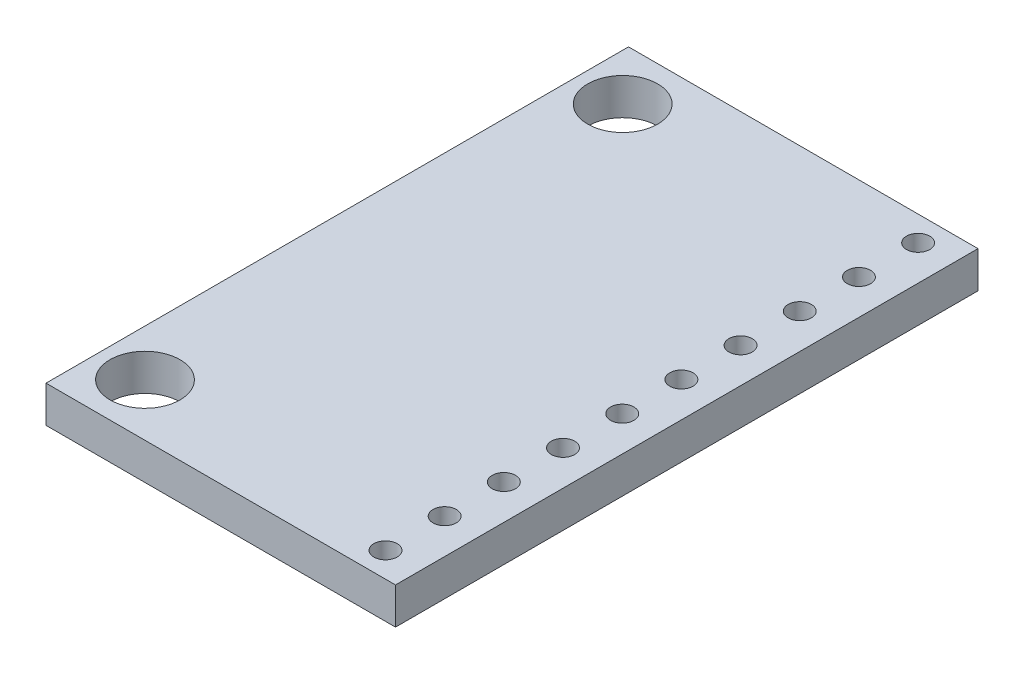
ISO-10303-21;
HEADER;
FILE_DESCRIPTION(('STEP AP214'),'2;1');
FILE_NAME('part.step','',(''),(''),'','','');
FILE_SCHEMA(('AUTOMOTIVE_DESIGN { 1 0 10303 214 1 1 1 1 }'));
ENDSEC;
DATA;
#1=APPLICATION_CONTEXT('core data for automotive mechanical design processes');
#2=APPLICATION_PROTOCOL_DEFINITION('international standard','automotive_design',2000,#1);
#3=PRODUCT_CONTEXT('',#1,'mechanical');
#4=PRODUCT('Part','Part','',(#3));
#5=PRODUCT_RELATED_PRODUCT_CATEGORY('part','',(#4));
#6=PRODUCT_DEFINITION_FORMATION('','',#4);
#7=PRODUCT_DEFINITION_CONTEXT('part definition',#1,'design');
#8=PRODUCT_DEFINITION('design','',#6,#7);
#9=PRODUCT_DEFINITION_SHAPE('','',#8);
#10=(LENGTH_UNIT() NAMED_UNIT(*) SI_UNIT(.MILLI.,.METRE.));
#11=(NAMED_UNIT(*) PLANE_ANGLE_UNIT() SI_UNIT($,.RADIAN.));
#12=(NAMED_UNIT(*) SI_UNIT($,.STERADIAN.) SOLID_ANGLE_UNIT());
#13=UNCERTAINTY_MEASURE_WITH_UNIT(LENGTH_MEASURE(1.E-05),#10,'distance_accuracy_value','');
#14=(GEOMETRIC_REPRESENTATION_CONTEXT(3) GLOBAL_UNCERTAINTY_ASSIGNED_CONTEXT((#13)) GLOBAL_UNIT_ASSIGNED_CONTEXT((#10,
#11,#12)) REPRESENTATION_CONTEXT('',''));
#15=CARTESIAN_POINT('',(0.,0.,0.));
#16=DIRECTION('',(0.,0.,1.));
#17=DIRECTION('',(1.,0.,0.));
#18=AXIS2_PLACEMENT_3D('',#15,#16,#17);
#19=CARTESIAN_POINT('',(0.,0.,0.));
#20=DIRECTION('',(0.,1.,0.));
#21=DIRECTION('',(0.,0.,1.));
#22=AXIS2_PLACEMENT_3D('',#19,#20,#21);
#23=PLANE('',#22);
#24=CARTESIAN_POINT('',(6.,0.,11.43));
#25=DIRECTION('',(0.,1.,0.));
#26=DIRECTION('',(0.,0.,1.));
#27=AXIS2_PLACEMENT_3D('',#24,#25,#26);
#28=CIRCLE('',#27,0.5);
#29=CARTESIAN_POINT('',(6.,0.,11.93));
#30=VERTEX_POINT('',#29);
#31=EDGE_CURVE('E115',#30,#30,#28,.T.);
#32=ORIENTED_EDGE('',*,*,#31,.T.);
#33=EDGE_LOOP('',(#32));
#34=FACE_BOUND('',#33,.T.);
#35=CARTESIAN_POINT('',(6.,0.,8.89));
#36=DIRECTION('',(0.,1.,0.));
#37=DIRECTION('',(0.,0.,1.));
#38=AXIS2_PLACEMENT_3D('',#35,#36,#37);
#39=CIRCLE('',#38,0.5);
#40=CARTESIAN_POINT('',(6.,0.,9.39));
#41=VERTEX_POINT('',#40);
#42=EDGE_CURVE('E119',#41,#41,#39,.T.);
#43=ORIENTED_EDGE('',*,*,#42,.T.);
#44=EDGE_LOOP('',(#43));
#45=FACE_BOUND('',#44,.T.);
#46=CARTESIAN_POINT('',(6.,0.,6.35));
#47=DIRECTION('',(0.,1.,0.));
#48=DIRECTION('',(0.,0.,1.));
#49=AXIS2_PLACEMENT_3D('',#46,#47,#48);
#50=CIRCLE('',#49,0.5);
#51=CARTESIAN_POINT('',(6.,0.,6.85));
#52=VERTEX_POINT('',#51);
#53=EDGE_CURVE('E122',#52,#52,#50,.T.);
#54=ORIENTED_EDGE('',*,*,#53,.T.);
#55=EDGE_LOOP('',(#54));
#56=FACE_BOUND('',#55,.T.);
#57=CARTESIAN_POINT('',(6.,0.,3.81));
#58=DIRECTION('',(0.,1.,0.));
#59=DIRECTION('',(0.,0.,1.));
#60=AXIS2_PLACEMENT_3D('',#57,#58,#59);
#61=CIRCLE('',#60,0.5);
#62=CARTESIAN_POINT('',(6.,0.,4.31));
#63=VERTEX_POINT('',#62);
#64=EDGE_CURVE('E125',#63,#63,#61,.T.);
#65=ORIENTED_EDGE('',*,*,#64,.T.);
#66=EDGE_LOOP('',(#65));
#67=FACE_BOUND('',#66,.T.);
#68=CARTESIAN_POINT('',(6.,0.,1.27));
#69=DIRECTION('',(0.,1.,0.));
#70=DIRECTION('',(0.,0.,1.));
#71=AXIS2_PLACEMENT_3D('',#68,#69,#70);
#72=CIRCLE('',#71,0.5);
#73=CARTESIAN_POINT('',(6.,0.,1.77));
#74=VERTEX_POINT('',#73);
#75=EDGE_CURVE('E128',#74,#74,#72,.T.);
#76=ORIENTED_EDGE('',*,*,#75,.T.);
#77=EDGE_LOOP('',(#76));
#78=FACE_BOUND('',#77,.T.);
#79=CARTESIAN_POINT('',(6.,0.,-1.27));
#80=DIRECTION('',(0.,1.,0.));
#81=DIRECTION('',(0.,0.,1.));
#82=AXIS2_PLACEMENT_3D('',#79,#80,#81);
#83=CIRCLE('',#82,0.5);
#84=CARTESIAN_POINT('',(6.,0.,-0.77));
#85=VERTEX_POINT('',#84);
#86=EDGE_CURVE('E131',#85,#85,#83,.T.);
#87=ORIENTED_EDGE('',*,*,#86,.T.);
#88=EDGE_LOOP('',(#87));
#89=FACE_BOUND('',#88,.T.);
#90=CARTESIAN_POINT('',(6.,0.,-3.81));
#91=DIRECTION('',(0.,1.,0.));
#92=DIRECTION('',(0.,0.,1.));
#93=AXIS2_PLACEMENT_3D('',#90,#91,#92);
#94=CIRCLE('',#93,0.5);
#95=CARTESIAN_POINT('',(6.,0.,-3.31));
#96=VERTEX_POINT('',#95);
#97=EDGE_CURVE('E134',#96,#96,#94,.T.);
#98=ORIENTED_EDGE('',*,*,#97,.T.);
#99=EDGE_LOOP('',(#98));
#100=FACE_BOUND('',#99,.T.);
#101=CARTESIAN_POINT('',(6.,0.,-6.35));
#102=DIRECTION('',(0.,1.,0.));
#103=DIRECTION('',(0.,0.,1.));
#104=AXIS2_PLACEMENT_3D('',#101,#102,#103);
#105=CIRCLE('',#104,0.5);
#106=CARTESIAN_POINT('',(6.,0.,-5.85));
#107=VERTEX_POINT('',#106);
#108=EDGE_CURVE('E137',#107,#107,#105,.T.);
#109=ORIENTED_EDGE('',*,*,#108,.T.);
#110=EDGE_LOOP('',(#109));
#111=FACE_BOUND('',#110,.T.);
#112=CARTESIAN_POINT('',(6.,0.,-8.89));
#113=DIRECTION('',(0.,1.,0.));
#114=DIRECTION('',(0.,0.,1.));
#115=AXIS2_PLACEMENT_3D('',#112,#113,#114);
#116=CIRCLE('',#115,0.5);
#117=CARTESIAN_POINT('',(6.,0.,-8.39));
#118=VERTEX_POINT('',#117);
#119=EDGE_CURVE('E140',#118,#118,#116,.T.);
#120=ORIENTED_EDGE('',*,*,#119,.T.);
#121=EDGE_LOOP('',(#120));
#122=FACE_BOUND('',#121,.T.);
#123=CARTESIAN_POINT('',(6.,0.,-11.43));
#124=DIRECTION('',(0.,1.,0.));
#125=DIRECTION('',(0.,0.,1.));
#126=AXIS2_PLACEMENT_3D('',#123,#124,#125);
#127=CIRCLE('',#126,0.5);
#128=CARTESIAN_POINT('',(6.,0.,-10.93));
#129=VERTEX_POINT('',#128);
#130=EDGE_CURVE('E143',#129,#129,#127,.T.);
#131=ORIENTED_EDGE('',*,*,#130,.T.);
#132=EDGE_LOOP('',(#131));
#133=FACE_BOUND('',#132,.T.);
#134=CARTESIAN_POINT('',(-5.5,0.,10.25));
#135=DIRECTION('',(0.,1.,0.));
#136=DIRECTION('',(0.,0.,1.));
#137=AXIS2_PLACEMENT_3D('',#134,#135,#136);
#138=CIRCLE('',#137,1.5);
#139=CARTESIAN_POINT('',(-5.5,0.,11.75));
#140=VERTEX_POINT('',#139);
#141=EDGE_CURVE('E145',#140,#140,#138,.T.);
#142=ORIENTED_EDGE('',*,*,#141,.T.);
#143=EDGE_LOOP('',(#142));
#144=FACE_BOUND('',#143,.T.);
#145=CARTESIAN_POINT('',(-5.5,0.,-10.25));
#146=DIRECTION('',(0.,1.,0.));
#147=DIRECTION('',(0.,0.,1.));
#148=AXIS2_PLACEMENT_3D('',#145,#146,#147);
#149=CIRCLE('',#148,1.5);
#150=CARTESIAN_POINT('',(-5.5,0.,-8.75));
#151=VERTEX_POINT('',#150);
#152=EDGE_CURVE('E20',#151,#151,#149,.T.);
#153=ORIENTED_EDGE('',*,*,#152,.T.);
#154=EDGE_LOOP('',(#153));
#155=FACE_BOUND('',#154,.T.);
#156=DIRECTION('',(0.,0.,-1.));
#157=VECTOR('',#156,1.);
#158=CARTESIAN_POINT('',(7.5,0.,12.5));
#159=LINE('',#158,#157);
#160=CARTESIAN_POINT('',(7.5,0.,12.5));
#161=VERTEX_POINT('',#160);
#162=CARTESIAN_POINT('',(7.5,0.,-12.5));
#163=VERTEX_POINT('',#162);
#164=EDGE_CURVE('E154',#161,#163,#159,.T.);
#165=ORIENTED_EDGE('',*,*,#164,.F.);
#166=DIRECTION('',(1.,0.,0.));
#167=VECTOR('',#166,1.);
#168=CARTESIAN_POINT('',(-7.5,0.,12.5));
#169=LINE('',#168,#167);
#170=CARTESIAN_POINT('',(-7.5,0.,12.5));
#171=VERTEX_POINT('',#170);
#172=EDGE_CURVE('E55',#171,#161,#169,.T.);
#173=ORIENTED_EDGE('',*,*,#172,.F.);
#174=DIRECTION('',(0.,0.,1.));
#175=VECTOR('',#174,1.);
#176=CARTESIAN_POINT('',(-7.5,0.,-12.5));
#177=LINE('',#176,#175);
#178=CARTESIAN_POINT('',(-7.5,0.,-12.5));
#179=VERTEX_POINT('',#178);
#180=EDGE_CURVE('E57',#179,#171,#177,.T.);
#181=ORIENTED_EDGE('',*,*,#180,.F.);
#182=DIRECTION('',(-1.,0.,0.));
#183=VECTOR('',#182,1.);
#184=CARTESIAN_POINT('',(7.5,0.,-12.5));
#185=LINE('',#184,#183);
#186=EDGE_CURVE('E59',#163,#179,#185,.T.);
#187=ORIENTED_EDGE('',*,*,#186,.F.);
#188=EDGE_LOOP('',(#165,#173,#181,#187));
#189=FACE_BOUND('',#188,.T.);
#190=ADVANCED_FACE('F17',(#34,#45,#56,#67,#78,#89,#100,#111,#122,#133,#144,#155,#189),#23,.F.);
#191=CARTESIAN_POINT('',(7.5,0.,-12.5));
#192=DIRECTION('',(0.,0.,-1.));
#193=DIRECTION('',(-1.,0.,0.));
#194=AXIS2_PLACEMENT_3D('',#191,#192,#193);
#195=PLANE('',#194);
#196=DIRECTION('',(1.,0.,0.));
#197=VECTOR('',#196,1.);
#198=CARTESIAN_POINT('',(0.,1.57,-12.5));
#199=LINE('',#198,#197);
#200=CARTESIAN_POINT('',(7.5,1.57,-12.5));
#201=VERTEX_POINT('',#200);
#202=CARTESIAN_POINT('',(-7.5,1.57,-12.5));
#203=VERTEX_POINT('',#202);
#204=EDGE_CURVE('E118',#201,#203,#199,.F.);
#205=ORIENTED_EDGE('',*,*,#204,.F.);
#206=DIRECTION('',(0.,1.,0.));
#207=VECTOR('',#206,1.);
#208=CARTESIAN_POINT('',(7.5,0.,-12.5));
#209=LINE('',#208,#207);
#210=EDGE_CURVE('E70',#163,#201,#209,.T.);
#211=ORIENTED_EDGE('',*,*,#210,.F.);
#212=ORIENTED_EDGE('',*,*,#186,.T.);
#213=DIRECTION('',(0.,1.,0.));
#214=VECTOR('',#213,1.);
#215=CARTESIAN_POINT('',(-7.5,0.,-12.5));
#216=LINE('',#215,#214);
#217=EDGE_CURVE('E64',#203,#179,#216,.F.);
#218=ORIENTED_EDGE('',*,*,#217,.F.);
#219=EDGE_LOOP('',(#205,#211,#212,#218));
#220=FACE_BOUND('',#219,.T.);
#221=ADVANCED_FACE('F67',(#220),#195,.T.);
#222=CARTESIAN_POINT('',(-7.5,0.,-12.5));
#223=DIRECTION('',(-1.,0.,0.));
#224=DIRECTION('',(0.,0.,1.));
#225=AXIS2_PLACEMENT_3D('',#222,#223,#224);
#226=PLANE('',#225);
#227=DIRECTION('',(0.,0.,1.));
#228=VECTOR('',#227,1.);
#229=CARTESIAN_POINT('',(-7.5,1.57,0.));
#230=LINE('',#229,#228);
#231=CARTESIAN_POINT('',(-7.5,1.57,12.5));
#232=VERTEX_POINT('',#231);
#233=EDGE_CURVE('E75',#203,#232,#230,.T.);
#234=ORIENTED_EDGE('',*,*,#233,.F.);
#235=ORIENTED_EDGE('',*,*,#217,.T.);
#236=ORIENTED_EDGE('',*,*,#180,.T.);
#237=DIRECTION('',(0.,1.,0.));
#238=VECTOR('',#237,1.);
#239=CARTESIAN_POINT('',(-7.5,0.,12.5));
#240=LINE('',#239,#238);
#241=EDGE_CURVE('E78',#232,#171,#240,.F.);
#242=ORIENTED_EDGE('',*,*,#241,.F.);
#243=EDGE_LOOP('',(#234,#235,#236,#242));
#244=FACE_BOUND('',#243,.T.);
#245=ADVANCED_FACE('F73',(#244),#226,.T.);
#246=CARTESIAN_POINT('',(-7.5,0.,12.5));
#247=DIRECTION('',(0.,0.,1.));
#248=DIRECTION('',(1.,0.,0.));
#249=AXIS2_PLACEMENT_3D('',#246,#247,#248);
#250=PLANE('',#249);
#251=DIRECTION('',(1.,0.,0.));
#252=VECTOR('',#251,1.);
#253=CARTESIAN_POINT('',(0.,1.57,12.5));
#254=LINE('',#253,#252);
#255=CARTESIAN_POINT('',(7.5,1.57,12.5));
#256=VERTEX_POINT('',#255);
#257=EDGE_CURVE('E161',#232,#256,#254,.T.);
#258=ORIENTED_EDGE('',*,*,#257,.F.);
#259=ORIENTED_EDGE('',*,*,#241,.T.);
#260=ORIENTED_EDGE('',*,*,#172,.T.);
#261=DIRECTION('',(0.,1.,0.));
#262=VECTOR('',#261,1.);
#263=CARTESIAN_POINT('',(7.5,0.,12.5));
#264=LINE('',#263,#262);
#265=EDGE_CURVE('E35',#256,#161,#264,.F.);
#266=ORIENTED_EDGE('',*,*,#265,.F.);
#267=EDGE_LOOP('',(#258,#259,#260,#266));
#268=FACE_BOUND('',#267,.T.);
#269=ADVANCED_FACE('F159',(#268),#250,.T.);
#270=CARTESIAN_POINT('',(7.5,0.,12.5));
#271=DIRECTION('',(1.,0.,0.));
#272=DIRECTION('',(0.,0.,-1.));
#273=AXIS2_PLACEMENT_3D('',#270,#271,#272);
#274=PLANE('',#273);
#275=DIRECTION('',(0.,0.,1.));
#276=VECTOR('',#275,1.);
#277=CARTESIAN_POINT('',(7.5,1.57,0.));
#278=LINE('',#277,#276);
#279=EDGE_CURVE('E114',#256,#201,#278,.F.);
#280=ORIENTED_EDGE('',*,*,#279,.F.);
#281=ORIENTED_EDGE('',*,*,#265,.T.);
#282=ORIENTED_EDGE('',*,*,#164,.T.);
#283=ORIENTED_EDGE('',*,*,#210,.T.);
#284=EDGE_LOOP('',(#280,#281,#282,#283));
#285=FACE_BOUND('',#284,.T.);
#286=ADVANCED_FACE('F167',(#285),#274,.T.);
#287=CARTESIAN_POINT('',(-5.5,0.,-10.25));
#288=DIRECTION('',(0.,1.,0.));
#289=DIRECTION('',(0.,0.,1.));
#290=AXIS2_PLACEMENT_3D('',#287,#288,#289);
#291=CYLINDRICAL_SURFACE('',#290,1.5);
#292=ORIENTED_EDGE('',*,*,#152,.F.);
#293=EDGE_LOOP('',(#292));
#294=FACE_BOUND('',#293,.T.);
#295=CARTESIAN_POINT('',(-5.5,1.57,-10.25));
#296=DIRECTION('',(0.,1.,0.));
#297=DIRECTION('',(0.,0.,1.));
#298=AXIS2_PLACEMENT_3D('',#295,#296,#297);
#299=CIRCLE('',#298,1.5);
#300=CARTESIAN_POINT('',(-5.5,1.57,-8.75));
#301=VERTEX_POINT('',#300);
#302=EDGE_CURVE('E111',#301,#301,#299,.F.);
#303=ORIENTED_EDGE('',*,*,#302,.F.);
#304=EDGE_LOOP('',(#303));
#305=FACE_BOUND('',#304,.T.);
#306=ADVANCED_FACE('F169',(#294,#305),#291,.F.);
#307=CARTESIAN_POINT('',(-5.5,0.,10.25));
#308=DIRECTION('',(0.,1.,0.));
#309=DIRECTION('',(0.,0.,1.));
#310=AXIS2_PLACEMENT_3D('',#307,#308,#309);
#311=CYLINDRICAL_SURFACE('',#310,1.5);
#312=ORIENTED_EDGE('',*,*,#141,.F.);
#313=EDGE_LOOP('',(#312));
#314=FACE_BOUND('',#313,.T.);
#315=CARTESIAN_POINT('',(-5.5,1.57,10.25));
#316=DIRECTION('',(0.,1.,0.));
#317=DIRECTION('',(0.,0.,1.));
#318=AXIS2_PLACEMENT_3D('',#315,#316,#317);
#319=CIRCLE('',#318,1.5);
#320=CARTESIAN_POINT('',(-5.5,1.57,11.75));
#321=VERTEX_POINT('',#320);
#322=EDGE_CURVE('E108',#321,#321,#319,.F.);
#323=ORIENTED_EDGE('',*,*,#322,.F.);
#324=EDGE_LOOP('',(#323));
#325=FACE_BOUND('',#324,.T.);
#326=ADVANCED_FACE('F176',(#314,#325),#311,.F.);
#327=CARTESIAN_POINT('',(6.,0.,-11.43));
#328=DIRECTION('',(0.,1.,0.));
#329=DIRECTION('',(0.,0.,1.));
#330=AXIS2_PLACEMENT_3D('',#327,#328,#329);
#331=CYLINDRICAL_SURFACE('',#330,0.5);
#332=ORIENTED_EDGE('',*,*,#130,.F.);
#333=EDGE_LOOP('',(#332));
#334=FACE_BOUND('',#333,.T.);
#335=CARTESIAN_POINT('',(6.,1.57,-11.43));
#336=DIRECTION('',(0.,1.,0.));
#337=DIRECTION('',(0.,0.,1.));
#338=AXIS2_PLACEMENT_3D('',#335,#336,#337);
#339=CIRCLE('',#338,0.5);
#340=CARTESIAN_POINT('',(6.,1.57,-10.93));
#341=VERTEX_POINT('',#340);
#342=EDGE_CURVE('E105',#341,#341,#339,.F.);
#343=ORIENTED_EDGE('',*,*,#342,.F.);
#344=EDGE_LOOP('',(#343));
#345=FACE_BOUND('',#344,.T.);
#346=ADVANCED_FACE('F222',(#334,#345),#331,.F.);
#347=CARTESIAN_POINT('',(6.,0.,-8.89));
#348=DIRECTION('',(0.,1.,0.));
#349=DIRECTION('',(0.,0.,1.));
#350=AXIS2_PLACEMENT_3D('',#347,#348,#349);
#351=CYLINDRICAL_SURFACE('',#350,0.5);
#352=ORIENTED_EDGE('',*,*,#119,.F.);
#353=EDGE_LOOP('',(#352));
#354=FACE_BOUND('',#353,.T.);
#355=CARTESIAN_POINT('',(6.,1.57,-8.89));
#356=DIRECTION('',(0.,1.,0.));
#357=DIRECTION('',(0.,0.,1.));
#358=AXIS2_PLACEMENT_3D('',#355,#356,#357);
#359=CIRCLE('',#358,0.5);
#360=CARTESIAN_POINT('',(6.,1.57,-8.39));
#361=VERTEX_POINT('',#360);
#362=EDGE_CURVE('E102',#361,#361,#359,.F.);
#363=ORIENTED_EDGE('',*,*,#362,.F.);
#364=EDGE_LOOP('',(#363));
#365=FACE_BOUND('',#364,.T.);
#366=ADVANCED_FACE('F218',(#354,#365),#351,.F.);
#367=CARTESIAN_POINT('',(6.,0.,-6.35));
#368=DIRECTION('',(0.,1.,0.));
#369=DIRECTION('',(0.,0.,1.));
#370=AXIS2_PLACEMENT_3D('',#367,#368,#369);
#371=CYLINDRICAL_SURFACE('',#370,0.5);
#372=ORIENTED_EDGE('',*,*,#108,.F.);
#373=EDGE_LOOP('',(#372));
#374=FACE_BOUND('',#373,.T.);
#375=CARTESIAN_POINT('',(6.,1.57,-6.35));
#376=DIRECTION('',(0.,1.,0.));
#377=DIRECTION('',(0.,0.,1.));
#378=AXIS2_PLACEMENT_3D('',#375,#376,#377);
#379=CIRCLE('',#378,0.5);
#380=CARTESIAN_POINT('',(6.,1.57,-5.85));
#381=VERTEX_POINT('',#380);
#382=EDGE_CURVE('E99',#381,#381,#379,.F.);
#383=ORIENTED_EDGE('',*,*,#382,.F.);
#384=EDGE_LOOP('',(#383));
#385=FACE_BOUND('',#384,.T.);
#386=ADVANCED_FACE('F214',(#374,#385),#371,.F.);
#387=CARTESIAN_POINT('',(6.,0.,-3.81));
#388=DIRECTION('',(0.,1.,0.));
#389=DIRECTION('',(0.,0.,1.));
#390=AXIS2_PLACEMENT_3D('',#387,#388,#389);
#391=CYLINDRICAL_SURFACE('',#390,0.5);
#392=ORIENTED_EDGE('',*,*,#97,.F.);
#393=EDGE_LOOP('',(#392));
#394=FACE_BOUND('',#393,.T.);
#395=CARTESIAN_POINT('',(6.,1.57,-3.81));
#396=DIRECTION('',(0.,1.,0.));
#397=DIRECTION('',(0.,0.,1.));
#398=AXIS2_PLACEMENT_3D('',#395,#396,#397);
#399=CIRCLE('',#398,0.5);
#400=CARTESIAN_POINT('',(6.,1.57,-3.31));
#401=VERTEX_POINT('',#400);
#402=EDGE_CURVE('E96',#401,#401,#399,.F.);
#403=ORIENTED_EDGE('',*,*,#402,.F.);
#404=EDGE_LOOP('',(#403));
#405=FACE_BOUND('',#404,.T.);
#406=ADVANCED_FACE('F210',(#394,#405),#391,.F.);
#407=CARTESIAN_POINT('',(6.,0.,-1.27));
#408=DIRECTION('',(0.,1.,0.));
#409=DIRECTION('',(0.,0.,1.));
#410=AXIS2_PLACEMENT_3D('',#407,#408,#409);
#411=CYLINDRICAL_SURFACE('',#410,0.5);
#412=ORIENTED_EDGE('',*,*,#86,.F.);
#413=EDGE_LOOP('',(#412));
#414=FACE_BOUND('',#413,.T.);
#415=CARTESIAN_POINT('',(6.,1.57,-1.27));
#416=DIRECTION('',(0.,1.,0.));
#417=DIRECTION('',(0.,0.,1.));
#418=AXIS2_PLACEMENT_3D('',#415,#416,#417);
#419=CIRCLE('',#418,0.5);
#420=CARTESIAN_POINT('',(6.,1.57,-0.77));
#421=VERTEX_POINT('',#420);
#422=EDGE_CURVE('E93',#421,#421,#419,.F.);
#423=ORIENTED_EDGE('',*,*,#422,.F.);
#424=EDGE_LOOP('',(#423));
#425=FACE_BOUND('',#424,.T.);
#426=ADVANCED_FACE('F206',(#414,#425),#411,.F.);
#427=CARTESIAN_POINT('',(6.,0.,1.27));
#428=DIRECTION('',(0.,1.,0.));
#429=DIRECTION('',(0.,0.,1.));
#430=AXIS2_PLACEMENT_3D('',#427,#428,#429);
#431=CYLINDRICAL_SURFACE('',#430,0.5);
#432=ORIENTED_EDGE('',*,*,#75,.F.);
#433=EDGE_LOOP('',(#432));
#434=FACE_BOUND('',#433,.T.);
#435=CARTESIAN_POINT('',(6.,1.57,1.27));
#436=DIRECTION('',(0.,1.,0.));
#437=DIRECTION('',(0.,0.,1.));
#438=AXIS2_PLACEMENT_3D('',#435,#436,#437);
#439=CIRCLE('',#438,0.5);
#440=CARTESIAN_POINT('',(6.,1.57,1.77));
#441=VERTEX_POINT('',#440);
#442=EDGE_CURVE('E90',#441,#441,#439,.F.);
#443=ORIENTED_EDGE('',*,*,#442,.F.);
#444=EDGE_LOOP('',(#443));
#445=FACE_BOUND('',#444,.T.);
#446=ADVANCED_FACE('F202',(#434,#445),#431,.F.);
#447=CARTESIAN_POINT('',(6.,0.,3.81));
#448=DIRECTION('',(0.,1.,0.));
#449=DIRECTION('',(0.,0.,1.));
#450=AXIS2_PLACEMENT_3D('',#447,#448,#449);
#451=CYLINDRICAL_SURFACE('',#450,0.5);
#452=ORIENTED_EDGE('',*,*,#64,.F.);
#453=EDGE_LOOP('',(#452));
#454=FACE_BOUND('',#453,.T.);
#455=CARTESIAN_POINT('',(6.,1.57,3.81));
#456=DIRECTION('',(0.,1.,0.));
#457=DIRECTION('',(0.,0.,1.));
#458=AXIS2_PLACEMENT_3D('',#455,#456,#457);
#459=CIRCLE('',#458,0.5);
#460=CARTESIAN_POINT('',(6.,1.57,4.31));
#461=VERTEX_POINT('',#460);
#462=EDGE_CURVE('E87',#461,#461,#459,.F.);
#463=ORIENTED_EDGE('',*,*,#462,.F.);
#464=EDGE_LOOP('',(#463));
#465=FACE_BOUND('',#464,.T.);
#466=ADVANCED_FACE('F198',(#454,#465),#451,.F.);
#467=CARTESIAN_POINT('',(6.,0.,6.35));
#468=DIRECTION('',(0.,1.,0.));
#469=DIRECTION('',(0.,0.,1.));
#470=AXIS2_PLACEMENT_3D('',#467,#468,#469);
#471=CYLINDRICAL_SURFACE('',#470,0.5);
#472=ORIENTED_EDGE('',*,*,#53,.F.);
#473=EDGE_LOOP('',(#472));
#474=FACE_BOUND('',#473,.T.);
#475=CARTESIAN_POINT('',(6.,1.57,6.35));
#476=DIRECTION('',(0.,1.,0.));
#477=DIRECTION('',(0.,0.,1.));
#478=AXIS2_PLACEMENT_3D('',#475,#476,#477);
#479=CIRCLE('',#478,0.5);
#480=CARTESIAN_POINT('',(6.,1.57,6.85));
#481=VERTEX_POINT('',#480);
#482=EDGE_CURVE('E84',#481,#481,#479,.F.);
#483=ORIENTED_EDGE('',*,*,#482,.F.);
#484=EDGE_LOOP('',(#483));
#485=FACE_BOUND('',#484,.T.);
#486=ADVANCED_FACE('F194',(#474,#485),#471,.F.);
#487=CARTESIAN_POINT('',(6.,0.,8.89));
#488=DIRECTION('',(0.,1.,0.));
#489=DIRECTION('',(0.,0.,1.));
#490=AXIS2_PLACEMENT_3D('',#487,#488,#489);
#491=CYLINDRICAL_SURFACE('',#490,0.5);
#492=ORIENTED_EDGE('',*,*,#42,.F.);
#493=EDGE_LOOP('',(#492));
#494=FACE_BOUND('',#493,.T.);
#495=CARTESIAN_POINT('',(6.,1.57,8.89));
#496=DIRECTION('',(0.,1.,0.));
#497=DIRECTION('',(0.,0.,1.));
#498=AXIS2_PLACEMENT_3D('',#495,#496,#497);
#499=CIRCLE('',#498,0.5);
#500=CARTESIAN_POINT('',(6.,1.57,9.39));
#501=VERTEX_POINT('',#500);
#502=EDGE_CURVE('E26',#501,#501,#499,.F.);
#503=ORIENTED_EDGE('',*,*,#502,.F.);
#504=EDGE_LOOP('',(#503));
#505=FACE_BOUND('',#504,.T.);
#506=ADVANCED_FACE('F187',(#494,#505),#491,.F.);
#507=CARTESIAN_POINT('',(6.,0.,11.43));
#508=DIRECTION('',(0.,1.,0.));
#509=DIRECTION('',(0.,0.,1.));
#510=AXIS2_PLACEMENT_3D('',#507,#508,#509);
#511=CYLINDRICAL_SURFACE('',#510,0.5);
#512=ORIENTED_EDGE('',*,*,#31,.F.);
#513=EDGE_LOOP('',(#512));
#514=FACE_BOUND('',#513,.T.);
#515=CARTESIAN_POINT('',(6.,1.57,11.43));
#516=DIRECTION('',(0.,1.,0.));
#517=DIRECTION('',(0.,0.,1.));
#518=AXIS2_PLACEMENT_3D('',#515,#516,#517);
#519=CIRCLE('',#518,0.5);
#520=CARTESIAN_POINT('',(6.,1.57,11.93));
#521=VERTEX_POINT('',#520);
#522=EDGE_CURVE('E11',#521,#521,#519,.F.);
#523=ORIENTED_EDGE('',*,*,#522,.F.);
#524=EDGE_LOOP('',(#523));
#525=FACE_BOUND('',#524,.T.);
#526=ADVANCED_FACE('F181',(#514,#525),#511,.F.);
#527=CARTESIAN_POINT('',(0.,1.57,0.));
#528=DIRECTION('',(0.,1.,0.));
#529=DIRECTION('',(0.,0.,1.));
#530=AXIS2_PLACEMENT_3D('',#527,#528,#529);
#531=PLANE('',#530);
#532=ORIENTED_EDGE('',*,*,#522,.T.);
#533=EDGE_LOOP('',(#532));
#534=FACE_BOUND('',#533,.T.);
#535=ORIENTED_EDGE('',*,*,#502,.T.);
#536=EDGE_LOOP('',(#535));
#537=FACE_BOUND('',#536,.T.);
#538=ORIENTED_EDGE('',*,*,#482,.T.);
#539=EDGE_LOOP('',(#538));
#540=FACE_BOUND('',#539,.T.);
#541=ORIENTED_EDGE('',*,*,#462,.T.);
#542=EDGE_LOOP('',(#541));
#543=FACE_BOUND('',#542,.T.);
#544=ORIENTED_EDGE('',*,*,#442,.T.);
#545=EDGE_LOOP('',(#544));
#546=FACE_BOUND('',#545,.T.);
#547=ORIENTED_EDGE('',*,*,#422,.T.);
#548=EDGE_LOOP('',(#547));
#549=FACE_BOUND('',#548,.T.);
#550=ORIENTED_EDGE('',*,*,#402,.T.);
#551=EDGE_LOOP('',(#550));
#552=FACE_BOUND('',#551,.T.);
#553=ORIENTED_EDGE('',*,*,#382,.T.);
#554=EDGE_LOOP('',(#553));
#555=FACE_BOUND('',#554,.T.);
#556=ORIENTED_EDGE('',*,*,#362,.T.);
#557=EDGE_LOOP('',(#556));
#558=FACE_BOUND('',#557,.T.);
#559=ORIENTED_EDGE('',*,*,#342,.T.);
#560=EDGE_LOOP('',(#559));
#561=FACE_BOUND('',#560,.T.);
#562=ORIENTED_EDGE('',*,*,#322,.T.);
#563=EDGE_LOOP('',(#562));
#564=FACE_BOUND('',#563,.T.);
#565=ORIENTED_EDGE('',*,*,#302,.T.);
#566=EDGE_LOOP('',(#565));
#567=FACE_BOUND('',#566,.T.);
#568=ORIENTED_EDGE('',*,*,#257,.T.);
#569=ORIENTED_EDGE('',*,*,#279,.T.);
#570=ORIENTED_EDGE('',*,*,#204,.T.);
#571=ORIENTED_EDGE('',*,*,#233,.T.);
#572=EDGE_LOOP('',(#568,#569,#570,#571));
#573=FACE_BOUND('',#572,.T.);
#574=ADVANCED_FACE('F165',(#534,#537,#540,#543,#546,#549,#552,#555,#558,#561,#564,#567,#573),
#531,.T.);
#575=CLOSED_SHELL('',(#190,#221,#245,#269,#286,#306,#326,#346,#366,#386,#406,#426,#446,#466,
#486,#506,#526,#574));
#576=MANIFOLD_SOLID_BREP('B1',#575);
#577=ADVANCED_BREP_SHAPE_REPRESENTATION('',(#18,#576),#14);
#578=SHAPE_DEFINITION_REPRESENTATION(#9,#577);
ENDSEC;
END-ISO-10303-21;
